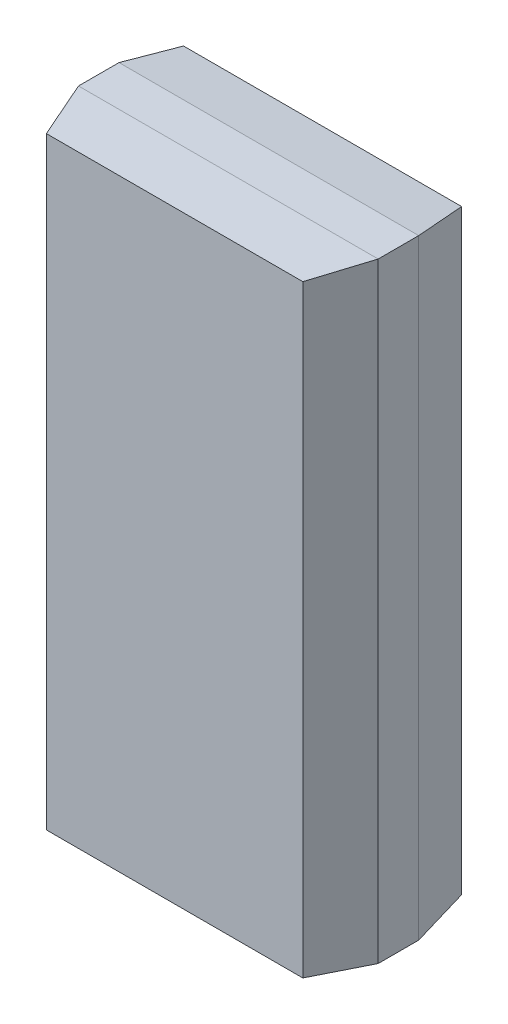
ISO-10303-21;
HEADER;
FILE_DESCRIPTION(('STEP AP214'),'2;1');
FILE_NAME('part.step','',(''),(''),'','','');
FILE_SCHEMA(('AUTOMOTIVE_DESIGN { 1 0 10303 214 1 1 1 1 }'));
ENDSEC;
DATA;
#1=APPLICATION_CONTEXT('core data for automotive mechanical design processes');
#2=APPLICATION_PROTOCOL_DEFINITION('international standard','automotive_design',2000,#1);
#3=PRODUCT_CONTEXT('',#1,'mechanical');
#4=PRODUCT('Part','Part','',(#3));
#5=PRODUCT_RELATED_PRODUCT_CATEGORY('part','',(#4));
#6=PRODUCT_DEFINITION_FORMATION('','',#4);
#7=PRODUCT_DEFINITION_CONTEXT('part definition',#1,'design');
#8=PRODUCT_DEFINITION('design','',#6,#7);
#9=PRODUCT_DEFINITION_SHAPE('','',#8);
#10=(LENGTH_UNIT() NAMED_UNIT(*) SI_UNIT(.MILLI.,.METRE.));
#11=(NAMED_UNIT(*) PLANE_ANGLE_UNIT() SI_UNIT($,.RADIAN.));
#12=(NAMED_UNIT(*) SI_UNIT($,.STERADIAN.) SOLID_ANGLE_UNIT());
#13=UNCERTAINTY_MEASURE_WITH_UNIT(LENGTH_MEASURE(1.E-05),#10,'distance_accuracy_value','');
#14=(GEOMETRIC_REPRESENTATION_CONTEXT(3) GLOBAL_UNCERTAINTY_ASSIGNED_CONTEXT((#13)) GLOBAL_UNIT_ASSIGNED_CONTEXT((#10,
#11,#12)) REPRESENTATION_CONTEXT('',''));
#15=CARTESIAN_POINT('',(0.,0.,0.));
#16=DIRECTION('',(0.,0.,1.));
#17=DIRECTION('',(1.,0.,0.));
#18=AXIS2_PLACEMENT_3D('',#15,#16,#17);
#19=CARTESIAN_POINT('',(-0.902,-2.121,1.092));
#20=DIRECTION('',(0.,0.,1.));
#21=DIRECTION('',(0.,1.,0.));
#22=AXIS2_PLACEMENT_3D('',#19,#20,#21);
#23=PLANE('',#22);
#24=CARTESIAN_POINT('',(0.902000000000002,-2.12062493690611,1.09197482041354));
#25=DIRECTION('',(-1.,0.,0.));
#26=VECTOR('',#25,1.);
#27=LINE('',#24,#26);
#28=CARTESIAN_POINT('',(0.902,-2.121,1.092));
#29=VERTEX_POINT('',#28);
#30=CARTESIAN_POINT('',(-0.902,-2.121,1.092));
#31=VERTEX_POINT('',#30);
#32=EDGE_CURVE('E11',#29,#31,#27,.T.);
#33=ORIENTED_EDGE('',*,*,#32,.F.);
#34=CARTESIAN_POINT('',(0.901707062513735,2.121,1.09188194114239));
#35=DIRECTION('',(0.,-1.,0.));
#36=VECTOR('',#35,1.);
#37=LINE('',#34,#36);
#38=CARTESIAN_POINT('',(0.902,2.121,1.092));
#39=VERTEX_POINT('',#38);
#40=EDGE_CURVE('E25',#39,#29,#37,.T.);
#41=ORIENTED_EDGE('',*,*,#40,.F.);
#42=CARTESIAN_POINT('',(-0.902000000000002,2.12062493690611,1.09197482041354));
#43=DIRECTION('',(1.,0.,0.));
#44=VECTOR('',#43,1.);
#45=LINE('',#42,#44);
#46=CARTESIAN_POINT('',(-0.902,2.121,1.092));
#47=VERTEX_POINT('',#46);
#48=EDGE_CURVE('E297',#47,#39,#45,.T.);
#49=ORIENTED_EDGE('',*,*,#48,.F.);
#50=CARTESIAN_POINT('',(-0.901707062513735,-2.121,1.09188194114239));
#51=DIRECTION('',(0.,1.,0.));
#52=VECTOR('',#51,1.);
#53=LINE('',#50,#52);
#54=EDGE_CURVE('E320',#31,#47,#53,.T.);
#55=ORIENTED_EDGE('',*,*,#54,.F.);
#56=EDGE_LOOP('',(#33,#41,#49,#55));
#57=FACE_BOUND('',#56,.T.);
#58=ADVANCED_FACE('F17',(#57),#23,.T.);
#59=CARTESIAN_POINT('',(-1.054,-2.146,0.714));
#60=DIRECTION('',(0.,-0.997754083923735,0.066983490604098));
#61=DIRECTION('',(0.,0.066983490604098,0.997754083923735));
#62=AXIS2_PLACEMENT_3D('',#59,#60,#61);
#63=PLANE('',#62);
#64=DIRECTION('',(-1.,0.,0.));
#65=VECTOR('',#64,1.);
#66=CARTESIAN_POINT('',(1.054,-2.146,0.714));
#67=LINE('',#66,#65);
#68=CARTESIAN_POINT('',(1.054,-2.146,0.714));
#69=VERTEX_POINT('',#68);
#70=CARTESIAN_POINT('',(-1.054,-2.146,0.714));
#71=VERTEX_POINT('',#70);
#72=EDGE_CURVE('E333',#69,#71,#67,.T.);
#73=ORIENTED_EDGE('',*,*,#72,.F.);
#74=CARTESIAN_POINT('',(0.901707062513735,-2.121,1.09188194114239));
#75=DIRECTION('',(0.373083121400156,-0.0619860866881315,-0.925724964329799));
#76=VECTOR('',#75,1.);
#77=LINE('',#74,#76);
#78=EDGE_CURVE('E340',#29,#69,#77,.T.);
#79=ORIENTED_EDGE('',*,*,#78,.F.);
#80=ORIENTED_EDGE('',*,*,#32,.T.);
#81=CARTESIAN_POINT('',(-1.054,-2.146,0.714));
#82=DIRECTION('',(0.373083121400184,0.0619860866869365,0.925724964329868));
#83=VECTOR('',#82,1.);
#84=LINE('',#81,#83);
#85=EDGE_CURVE('E241',#71,#31,#84,.T.);
#86=ORIENTED_EDGE('',*,*,#85,.F.);
#87=EDGE_LOOP('',(#73,#79,#80,#86));
#88=FACE_BOUND('',#87,.T.);
#89=ADVANCED_FACE('F246',(#88),#63,.T.);
#90=CARTESIAN_POINT('',(1.054,-2.146,0.714));
#91=DIRECTION('',(0.927508550667725,0.,0.373801937445829));
#92=DIRECTION('',(-0.373801937445829,0.,0.927508550667725));
#93=AXIS2_PLACEMENT_3D('',#90,#91,#92);
#94=PLANE('',#93);
#95=DIRECTION('',(0.,-1.,0.));
#96=VECTOR('',#95,1.);
#97=CARTESIAN_POINT('',(1.054,2.146,0.714));
#98=LINE('',#97,#96);
#99=CARTESIAN_POINT('',(1.054,2.146,0.714));
#100=VERTEX_POINT('',#99);
#101=EDGE_CURVE('E238',#100,#69,#98,.T.);
#102=ORIENTED_EDGE('',*,*,#101,.F.);
#103=CARTESIAN_POINT('',(0.902,2.12062493690611,1.09197482041354));
#104=DIRECTION('',(0.372916294821597,0.0621516357452849,-0.925781081698431));
#105=VECTOR('',#104,1.);
#106=LINE('',#103,#105);
#107=EDGE_CURVE('E234',#39,#100,#106,.T.);
#108=ORIENTED_EDGE('',*,*,#107,.F.);
#109=ORIENTED_EDGE('',*,*,#40,.T.);
#110=ORIENTED_EDGE('',*,*,#78,.T.);
#111=EDGE_LOOP('',(#102,#108,#109,#110));
#112=FACE_BOUND('',#111,.T.);
#113=ADVANCED_FACE('F211',(#112),#94,.T.);
#114=CARTESIAN_POINT('',(1.054,2.146,0.714));
#115=DIRECTION('',(0.,0.997754083923735,0.066983490604098));
#116=DIRECTION('',(0.,-0.066983490604098,0.997754083923735));
#117=AXIS2_PLACEMENT_3D('',#114,#115,#116);
#118=PLANE('',#117);
#119=DIRECTION('',(1.,0.,0.));
#120=VECTOR('',#119,1.);
#121=CARTESIAN_POINT('',(-1.054,2.146,0.714));
#122=LINE('',#121,#120);
#123=CARTESIAN_POINT('',(-1.054,2.146,0.714));
#124=VERTEX_POINT('',#123);
#125=EDGE_CURVE('E472',#124,#100,#122,.T.);
#126=ORIENTED_EDGE('',*,*,#125,.F.);
#127=CARTESIAN_POINT('',(-0.901707062513735,2.121,1.09188194114239));
#128=DIRECTION('',(-0.373083121400156,0.0619860866881315,-0.925724964329799));
#129=VECTOR('',#128,1.);
#130=LINE('',#127,#129);
#131=EDGE_CURVE('E193',#47,#124,#130,.T.);
#132=ORIENTED_EDGE('',*,*,#131,.F.);
#133=ORIENTED_EDGE('',*,*,#48,.T.);
#134=ORIENTED_EDGE('',*,*,#107,.T.);
#135=EDGE_LOOP('',(#126,#132,#133,#134));
#136=FACE_BOUND('',#135,.T.);
#137=ADVANCED_FACE('F200',(#136),#118,.T.);
#138=CARTESIAN_POINT('',(-1.054,2.146,0.714));
#139=DIRECTION('',(-0.927508550667725,0.,0.373801937445829));
#140=DIRECTION('',(0.373801937445829,0.,0.927508550667725));
#141=AXIS2_PLACEMENT_3D('',#138,#139,#140);
#142=PLANE('',#141);
#143=DIRECTION('',(0.,1.,0.));
#144=VECTOR('',#143,1.);
#145=CARTESIAN_POINT('',(-1.054,-2.146,0.714));
#146=LINE('',#145,#144);
#147=EDGE_CURVE('E190',#71,#124,#146,.T.);
#148=ORIENTED_EDGE('',*,*,#147,.F.);
#149=ORIENTED_EDGE('',*,*,#85,.T.);
#150=ORIENTED_EDGE('',*,*,#54,.T.);
#151=ORIENTED_EDGE('',*,*,#131,.T.);
#152=EDGE_LOOP('',(#148,#149,#150,#151));
#153=FACE_BOUND('',#152,.T.);
#154=ADVANCED_FACE('F210',(#153),#142,.T.);
#155=CARTESIAN_POINT('',(-1.054,-2.146,0.429));
#156=DIRECTION('',(0.,-1.,0.));
#157=DIRECTION('',(0.,0.,1.));
#158=AXIS2_PLACEMENT_3D('',#155,#156,#157);
#159=PLANE('',#158);
#160=CARTESIAN_POINT('',(1.054,-2.14671764905928,0.428903685847745));
#161=DIRECTION('',(-1.,0.,0.));
#162=VECTOR('',#161,1.);
#163=LINE('',#160,#162);
#164=CARTESIAN_POINT('',(1.054,-2.146,0.429));
#165=VERTEX_POINT('',#164);
#166=CARTESIAN_POINT('',(-1.054,-2.146,0.429));
#167=VERTEX_POINT('',#166);
#168=EDGE_CURVE('E186',#165,#167,#163,.T.);
#169=ORIENTED_EDGE('',*,*,#168,.F.);
#170=DIRECTION('',(0.,0.,-1.));
#171=VECTOR('',#170,1.);
#172=CARTESIAN_POINT('',(1.054,-2.146,0.714));
#173=LINE('',#172,#171);
#174=EDGE_CURVE('E367',#69,#165,#173,.T.);
#175=ORIENTED_EDGE('',*,*,#174,.F.);
#176=ORIENTED_EDGE('',*,*,#72,.T.);
#177=DIRECTION('',(0.,0.,1.));
#178=VECTOR('',#177,1.);
#179=CARTESIAN_POINT('',(-1.054,-2.146,0.429));
#180=LINE('',#179,#178);
#181=EDGE_CURVE('E364',#167,#71,#180,.T.);
#182=ORIENTED_EDGE('',*,*,#181,.F.);
#183=EDGE_LOOP('',(#169,#175,#176,#182));
#184=FACE_BOUND('',#183,.T.);
#185=ADVANCED_FACE('F381',(#184),#159,.T.);
#186=CARTESIAN_POINT('',(1.054,-2.146,0.429));
#187=DIRECTION('',(1.,0.,0.));
#188=DIRECTION('',(0.,0.,1.));
#189=AXIS2_PLACEMENT_3D('',#186,#187,#188);
#190=PLANE('',#189);
#191=CARTESIAN_POINT('',(1.05398626913889,2.146,0.429002760183305));
#192=DIRECTION('',(0.,-1.,0.));
#193=VECTOR('',#192,1.);
#194=LINE('',#191,#193);
#195=CARTESIAN_POINT('',(1.054,2.146,0.429));
#196=VERTEX_POINT('',#195);
#197=EDGE_CURVE('E368',#196,#165,#194,.T.);
#198=ORIENTED_EDGE('',*,*,#197,.F.);
#199=DIRECTION('',(0.,0.,-1.));
#200=VECTOR('',#199,1.);
#201=CARTESIAN_POINT('',(1.054,2.146,0.714));
#202=LINE('',#201,#200);
#203=EDGE_CURVE('E373',#100,#196,#202,.T.);
#204=ORIENTED_EDGE('',*,*,#203,.F.);
#205=ORIENTED_EDGE('',*,*,#101,.T.);
#206=ORIENTED_EDGE('',*,*,#174,.T.);
#207=EDGE_LOOP('',(#198,#204,#205,#206));
#208=FACE_BOUND('',#207,.T.);
#209=ADVANCED_FACE('F390',(#208),#190,.T.);
#210=CARTESIAN_POINT('',(1.054,2.146,0.429));
#211=DIRECTION('',(0.,1.,0.));
#212=DIRECTION('',(0.,0.,1.));
#213=AXIS2_PLACEMENT_3D('',#210,#211,#212);
#214=PLANE('',#213);
#215=CARTESIAN_POINT('',(-1.054,2.14671764905928,0.428903685847745));
#216=DIRECTION('',(1.,0.,0.));
#217=VECTOR('',#216,1.);
#218=LINE('',#215,#217);
#219=CARTESIAN_POINT('',(-1.054,2.146,0.429));
#220=VERTEX_POINT('',#219);
#221=EDGE_CURVE('E453',#220,#196,#218,.T.);
#222=ORIENTED_EDGE('',*,*,#221,.F.);
#223=DIRECTION('',(0.,0.,-1.));
#224=VECTOR('',#223,1.);
#225=CARTESIAN_POINT('',(-1.054,2.146,0.714));
#226=LINE('',#225,#224);
#227=EDGE_CURVE('E451',#124,#220,#226,.T.);
#228=ORIENTED_EDGE('',*,*,#227,.F.);
#229=ORIENTED_EDGE('',*,*,#125,.T.);
#230=ORIENTED_EDGE('',*,*,#203,.T.);
#231=EDGE_LOOP('',(#222,#228,#229,#230));
#232=FACE_BOUND('',#231,.T.);
#233=ADVANCED_FACE('F393',(#232),#214,.T.);
#234=CARTESIAN_POINT('',(-1.054,2.146,0.429));
#235=DIRECTION('',(-1.,0.,0.));
#236=DIRECTION('',(0.,0.,1.));
#237=AXIS2_PLACEMENT_3D('',#234,#235,#236);
#238=PLANE('',#237);
#239=CARTESIAN_POINT('',(-1.05398626913889,-2.146,0.429002760183305));
#240=DIRECTION('',(0.,1.,0.));
#241=VECTOR('',#240,1.);
#242=LINE('',#239,#241);
#243=EDGE_CURVE('E102',#167,#220,#242,.T.);
#244=ORIENTED_EDGE('',*,*,#243,.F.);
#245=ORIENTED_EDGE('',*,*,#181,.T.);
#246=ORIENTED_EDGE('',*,*,#147,.T.);
#247=ORIENTED_EDGE('',*,*,#227,.T.);
#248=EDGE_LOOP('',(#244,#245,#246,#247));
#249=FACE_BOUND('',#248,.T.);
#250=ADVANCED_FACE('F162',(#249),#238,.T.);
#251=CARTESIAN_POINT('',(-0.978,-2.096,0.051));
#252=DIRECTION('',(0.,-0.991113984662731,-0.133015297638893));
#253=DIRECTION('',(0.,-0.133015297638893,0.991113984662731));
#254=AXIS2_PLACEMENT_3D('',#251,#252,#253);
#255=PLANE('',#254);
#256=DIRECTION('',(-1.,0.,0.));
#257=VECTOR('',#256,1.);
#258=CARTESIAN_POINT('',(0.978,-2.096,0.051));
#259=LINE('',#258,#257);
#260=CARTESIAN_POINT('',(0.978,-2.096,0.051));
#261=VERTEX_POINT('',#260);
#262=CARTESIAN_POINT('',(-0.978,-2.096,0.051));
#263=VERTEX_POINT('',#262);
#264=EDGE_CURVE('E107',#261,#263,#259,.T.);
#265=ORIENTED_EDGE('',*,*,#264,.F.);
#266=CARTESIAN_POINT('',(1.05398626913889,-2.146,0.429002760183305));
#267=DIRECTION('',(-0.195405722316472,0.129993523591317,-0.972069075482958));
#268=VECTOR('',#267,1.);
#269=LINE('',#266,#268);
#270=EDGE_CURVE('E419',#165,#261,#269,.T.);
#271=ORIENTED_EDGE('',*,*,#270,.F.);
#272=ORIENTED_EDGE('',*,*,#168,.T.);
#273=CARTESIAN_POINT('',(-0.978,-2.096,0.051));
#274=DIRECTION('',(-0.195405722316498,-0.129993523590293,0.972069075483089));
#275=VECTOR('',#274,1.);
#276=LINE('',#273,#275);
#277=EDGE_CURVE('E148',#263,#167,#276,.T.);
#278=ORIENTED_EDGE('',*,*,#277,.F.);
#279=EDGE_LOOP('',(#265,#271,#272,#278));
#280=FACE_BOUND('',#279,.T.);
#281=ADVANCED_FACE('F153',(#280),#255,.T.);
#282=CARTESIAN_POINT('',(0.978,-2.096,0.051));
#283=DIRECTION('',(0.98038782008944,0.,-0.197077959752673));
#284=DIRECTION('',(0.197077959752673,0.,0.98038782008944));
#285=AXIS2_PLACEMENT_3D('',#282,#283,#284);
#286=PLANE('',#285);
#287=DIRECTION('',(0.,-1.,0.));
#288=VECTOR('',#287,1.);
#289=CARTESIAN_POINT('',(0.978,2.096,0.051));
#290=LINE('',#289,#288);
#291=CARTESIAN_POINT('',(0.978,2.096,0.051));
#292=VERTEX_POINT('',#291);
#293=EDGE_CURVE('E146',#292,#261,#290,.T.);
#294=ORIENTED_EDGE('',*,*,#293,.F.);
#295=CARTESIAN_POINT('',(1.054,2.14671764905928,0.428903685847745));
#296=DIRECTION('',(-0.19599022023027,-0.130435579039448,-0.971892171639804));
#297=VECTOR('',#296,1.);
#298=LINE('',#295,#297);
#299=EDGE_CURVE('E88',#196,#292,#298,.T.);
#300=ORIENTED_EDGE('',*,*,#299,.F.);
#301=ORIENTED_EDGE('',*,*,#197,.T.);
#302=ORIENTED_EDGE('',*,*,#270,.T.);
#303=EDGE_LOOP('',(#294,#300,#301,#302));
#304=FACE_BOUND('',#303,.T.);
#305=ADVANCED_FACE('F125',(#304),#286,.T.);
#306=CARTESIAN_POINT('',(0.978,2.096,0.051));
#307=DIRECTION('',(0.,0.991113984662731,-0.133015297638893));
#308=DIRECTION('',(0.,0.133015297638893,0.991113984662731));
#309=AXIS2_PLACEMENT_3D('',#306,#307,#308);
#310=PLANE('',#309);
#311=DIRECTION('',(1.,0.,0.));
#312=VECTOR('',#311,1.);
#313=CARTESIAN_POINT('',(-0.978,2.096,0.051));
#314=LINE('',#313,#312);
#315=CARTESIAN_POINT('',(-0.978,2.096,0.051));
#316=VERTEX_POINT('',#315);
#317=EDGE_CURVE('E81',#316,#292,#314,.T.);
#318=ORIENTED_EDGE('',*,*,#317,.F.);
#319=CARTESIAN_POINT('',(-1.05398626913889,2.146,0.429002760183305));
#320=DIRECTION('',(0.195405722316472,-0.129993523591317,-0.972069075482958));
#321=VECTOR('',#320,1.);
#322=LINE('',#319,#321);
#323=EDGE_CURVE('E85',#220,#316,#322,.T.);
#324=ORIENTED_EDGE('',*,*,#323,.F.);
#325=ORIENTED_EDGE('',*,*,#221,.T.);
#326=ORIENTED_EDGE('',*,*,#299,.T.);
#327=EDGE_LOOP('',(#318,#324,#325,#326));
#328=FACE_BOUND('',#327,.T.);
#329=ADVANCED_FACE('F83',(#328),#310,.T.);
#330=CARTESIAN_POINT('',(-0.978,2.096,0.051));
#331=DIRECTION('',(-0.98038782008944,0.,-0.197077959752673));
#332=DIRECTION('',(-0.197077959752673,0.,0.98038782008944));
#333=AXIS2_PLACEMENT_3D('',#330,#331,#332);
#334=PLANE('',#333);
#335=DIRECTION('',(0.,1.,0.));
#336=VECTOR('',#335,1.);
#337=CARTESIAN_POINT('',(-0.978,-2.096,0.051));
#338=LINE('',#337,#336);
#339=EDGE_CURVE('E100',#263,#316,#338,.T.);
#340=ORIENTED_EDGE('',*,*,#339,.F.);
#341=ORIENTED_EDGE('',*,*,#277,.T.);
#342=ORIENTED_EDGE('',*,*,#243,.T.);
#343=ORIENTED_EDGE('',*,*,#323,.T.);
#344=EDGE_LOOP('',(#340,#341,#342,#343));
#345=FACE_BOUND('',#344,.T.);
#346=ADVANCED_FACE('F98',(#345),#334,.T.);
#347=CARTESIAN_POINT('',(-0.978,2.096,0.051));
#348=DIRECTION('',(0.,0.,-1.));
#349=DIRECTION('',(0.,1.,0.));
#350=AXIS2_PLACEMENT_3D('',#347,#348,#349);
#351=PLANE('',#350);
#352=ORIENTED_EDGE('',*,*,#317,.T.);
#353=ORIENTED_EDGE('',*,*,#293,.T.);
#354=ORIENTED_EDGE('',*,*,#264,.T.);
#355=ORIENTED_EDGE('',*,*,#339,.T.);
#356=EDGE_LOOP('',(#352,#353,#354,#355));
#357=FACE_BOUND('',#356,.T.);
#358=ADVANCED_FACE('F106',(#357),#351,.T.);
#359=CLOSED_SHELL('',(#58,#89,#113,#137,#154,#185,#209,#233,#250,#281,#305,#329,#346,#358));
#360=MANIFOLD_SOLID_BREP('B1',#359);
#361=ADVANCED_BREP_SHAPE_REPRESENTATION('',(#18,#360),#14);
#362=SHAPE_DEFINITION_REPRESENTATION(#9,#361);
ENDSEC;
END-ISO-10303-21;
